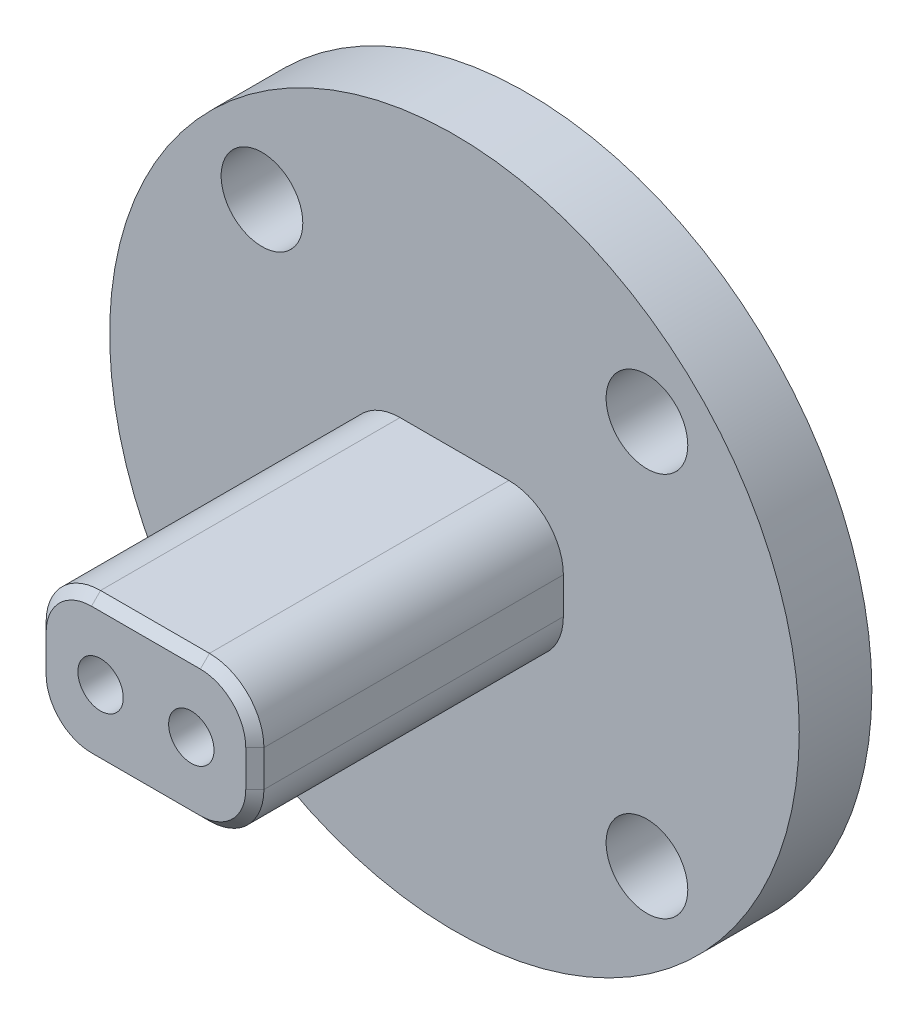
ISO-10303-21;
HEADER;
FILE_DESCRIPTION(('STEP AP214'),'2;1');
FILE_NAME('part.step','',(''),(''),'','','');
FILE_SCHEMA(('AUTOMOTIVE_DESIGN { 1 0 10303 214 1 1 1 1 }'));
ENDSEC;
DATA;
#1=APPLICATION_CONTEXT('core data for automotive mechanical design processes');
#2=APPLICATION_PROTOCOL_DEFINITION('international standard','automotive_design',2000,#1);
#3=PRODUCT_CONTEXT('',#1,'mechanical');
#4=PRODUCT('Part','Part','',(#3));
#5=PRODUCT_RELATED_PRODUCT_CATEGORY('part','',(#4));
#6=PRODUCT_DEFINITION_FORMATION('','',#4);
#7=PRODUCT_DEFINITION_CONTEXT('part definition',#1,'design');
#8=PRODUCT_DEFINITION('design','',#6,#7);
#9=PRODUCT_DEFINITION_SHAPE('','',#8);
#10=(LENGTH_UNIT() NAMED_UNIT(*) SI_UNIT(.MILLI.,.METRE.));
#11=(NAMED_UNIT(*) PLANE_ANGLE_UNIT() SI_UNIT($,.RADIAN.));
#12=(NAMED_UNIT(*) SI_UNIT($,.STERADIAN.) SOLID_ANGLE_UNIT());
#13=UNCERTAINTY_MEASURE_WITH_UNIT(LENGTH_MEASURE(1.E-05),#10,'distance_accuracy_value','');
#14=(GEOMETRIC_REPRESENTATION_CONTEXT(3) GLOBAL_UNCERTAINTY_ASSIGNED_CONTEXT((#13)) GLOBAL_UNIT_ASSIGNED_CONTEXT((#10,
#11,#12)) REPRESENTATION_CONTEXT('',''));
#15=CARTESIAN_POINT('',(0.,0.,0.));
#16=DIRECTION('',(0.,0.,1.));
#17=DIRECTION('',(1.,0.,0.));
#18=AXIS2_PLACEMENT_3D('',#15,#16,#17);
#19=CARTESIAN_POINT('',(0.,0.,4.));
#20=DIRECTION('',(0.,0.,1.));
#21=DIRECTION('',(1.,0.,0.));
#22=AXIS2_PLACEMENT_3D('',#19,#20,#21);
#23=PLANE('',#22);
#24=CARTESIAN_POINT('',(10.6066017177982,10.6066017177982,4.));
#25=DIRECTION('',(0.,0.,1.));
#26=DIRECTION('',(1.,0.,0.));
#27=AXIS2_PLACEMENT_3D('',#24,#25,#26);
#28=CIRCLE('',#27,2.24999999999999);
#29=CARTESIAN_POINT('',(12.8566017177982,10.6066017177982,4.));
#30=VERTEX_POINT('',#29);
#31=EDGE_CURVE('E221',#30,#30,#28,.T.);
#32=ORIENTED_EDGE('',*,*,#31,.F.);
#33=EDGE_LOOP('',(#32));
#34=FACE_BOUND('',#33,.T.);
#35=CARTESIAN_POINT('',(-10.6066017177982,-10.6066017177982,4.));
#36=DIRECTION('',(0.,0.,1.));
#37=DIRECTION('',(1.,0.,0.));
#38=AXIS2_PLACEMENT_3D('',#35,#36,#37);
#39=CIRCLE('',#38,2.24999999999999);
#40=CARTESIAN_POINT('',(-8.35660171779822,-10.6066017177982,4.));
#41=VERTEX_POINT('',#40);
#42=EDGE_CURVE('E229',#41,#41,#39,.T.);
#43=ORIENTED_EDGE('',*,*,#42,.F.);
#44=EDGE_LOOP('',(#43));
#45=FACE_BOUND('',#44,.T.);
#46=CARTESIAN_POINT('',(-10.6066017177982,10.6066017177982,4.));
#47=DIRECTION('',(0.,0.,1.));
#48=DIRECTION('',(1.,0.,0.));
#49=AXIS2_PLACEMENT_3D('',#46,#47,#48);
#50=CIRCLE('',#49,2.24999999999999);
#51=CARTESIAN_POINT('',(-8.35660171779823,10.6066017177982,4.));
#52=VERTEX_POINT('',#51);
#53=EDGE_CURVE('E237',#52,#52,#50,.T.);
#54=ORIENTED_EDGE('',*,*,#53,.F.);
#55=EDGE_LOOP('',(#54));
#56=FACE_BOUND('',#55,.T.);
#57=CARTESIAN_POINT('',(10.6066017177982,-10.6066017177982,4.));
#58=DIRECTION('',(0.,0.,1.));
#59=DIRECTION('',(1.,0.,0.));
#60=AXIS2_PLACEMENT_3D('',#57,#58,#59);
#61=CIRCLE('',#60,2.24999999999999);
#62=CARTESIAN_POINT('',(12.8566017177982,-10.6066017177982,4.));
#63=VERTEX_POINT('',#62);
#64=EDGE_CURVE('E245',#63,#63,#61,.T.);
#65=ORIENTED_EDGE('',*,*,#64,.F.);
#66=EDGE_LOOP('',(#65));
#67=FACE_BOUND('',#66,.T.);
#68=CARTESIAN_POINT('',(0.,0.,4.));
#69=DIRECTION('',(0.,0.,1.));
#70=DIRECTION('',(1.,0.,0.));
#71=AXIS2_PLACEMENT_3D('',#68,#69,#70);
#72=CIRCLE('',#71,19.);
#73=CARTESIAN_POINT('',(19.,0.,4.));
#74=VERTEX_POINT('',#73);
#75=EDGE_CURVE('E254',#74,#74,#72,.T.);
#76=ORIENTED_EDGE('',*,*,#75,.T.);
#77=EDGE_LOOP('',(#76));
#78=FACE_BOUND('',#77,.T.);
#79=DIRECTION('',(-1.,0.,0.));
#80=VECTOR('',#79,1.);
#81=CARTESIAN_POINT('',(-3.,4.,4.));
#82=LINE('',#81,#80);
#83=CARTESIAN_POINT('',(3.,4.,4.));
#84=VERTEX_POINT('',#83);
#85=CARTESIAN_POINT('',(-3.,4.,4.));
#86=VERTEX_POINT('',#85);
#87=EDGE_CURVE('E169',#84,#86,#82,.T.);
#88=ORIENTED_EDGE('',*,*,#87,.F.);
#89=CARTESIAN_POINT('',(3.,1.,4.));
#90=DIRECTION('',(0.,0.,1.));
#91=DIRECTION('',(-1.,0.,0.));
#92=AXIS2_PLACEMENT_3D('',#89,#90,#91);
#93=CIRCLE('',#92,3.);
#94=CARTESIAN_POINT('',(6.,1.,4.));
#95=VERTEX_POINT('',#94);
#96=EDGE_CURVE('E165',#95,#84,#93,.T.);
#97=ORIENTED_EDGE('',*,*,#96,.F.);
#98=DIRECTION('',(0.,1.,0.));
#99=VECTOR('',#98,1.);
#100=CARTESIAN_POINT('',(6.,-1.,4.));
#101=LINE('',#100,#99);
#102=CARTESIAN_POINT('',(6.,-1.,4.));
#103=VERTEX_POINT('',#102);
#104=EDGE_CURVE('E193',#103,#95,#101,.T.);
#105=ORIENTED_EDGE('',*,*,#104,.F.);
#106=CARTESIAN_POINT('',(3.,-1.,4.));
#107=DIRECTION('',(0.,0.,1.));
#108=DIRECTION('',(1.,0.,0.));
#109=AXIS2_PLACEMENT_3D('',#106,#107,#108);
#110=CIRCLE('',#109,3.);
#111=CARTESIAN_POINT('',(3.,-4.,4.));
#112=VERTEX_POINT('',#111);
#113=EDGE_CURVE('E189',#112,#103,#110,.T.);
#114=ORIENTED_EDGE('',*,*,#113,.F.);
#115=DIRECTION('',(1.,0.,0.));
#116=VECTOR('',#115,1.);
#117=CARTESIAN_POINT('',(-3.,-4.,4.));
#118=LINE('',#117,#116);
#119=CARTESIAN_POINT('',(-3.,-4.,4.));
#120=VERTEX_POINT('',#119);
#121=EDGE_CURVE('E185',#120,#112,#118,.T.);
#122=ORIENTED_EDGE('',*,*,#121,.F.);
#123=CARTESIAN_POINT('',(-3.,-1.,4.));
#124=DIRECTION('',(0.,0.,1.));
#125=DIRECTION('',(-1.,0.,0.));
#126=AXIS2_PLACEMENT_3D('',#123,#124,#125);
#127=CIRCLE('',#126,3.);
#128=CARTESIAN_POINT('',(-6.,-1.,4.));
#129=VERTEX_POINT('',#128);
#130=EDGE_CURVE('E181',#129,#120,#127,.T.);
#131=ORIENTED_EDGE('',*,*,#130,.F.);
#132=DIRECTION('',(0.,-1.,0.));
#133=VECTOR('',#132,1.);
#134=CARTESIAN_POINT('',(-6.,-1.,4.));
#135=LINE('',#134,#133);
#136=CARTESIAN_POINT('',(-6.,1.,4.));
#137=VERTEX_POINT('',#136);
#138=EDGE_CURVE('E177',#137,#129,#135,.T.);
#139=ORIENTED_EDGE('',*,*,#138,.F.);
#140=CARTESIAN_POINT('',(-3.,1.,4.));
#141=DIRECTION('',(0.,0.,1.));
#142=DIRECTION('',(-1.,0.,0.));
#143=AXIS2_PLACEMENT_3D('',#140,#141,#142);
#144=CIRCLE('',#143,3.);
#145=EDGE_CURVE('E173',#86,#137,#144,.T.);
#146=ORIENTED_EDGE('',*,*,#145,.F.);
#147=EDGE_LOOP('',(#88,#97,#105,#114,#122,#131,#139,#146));
#148=FACE_BOUND('',#147,.T.);
#149=ADVANCED_FACE('F45',(#34,#45,#56,#67,#78,#148),#23,.T.);
#150=CARTESIAN_POINT('',(0.,0.,4.));
#151=DIRECTION('',(0.,0.,-1.));
#152=DIRECTION('',(-1.,0.,0.));
#153=AXIS2_PLACEMENT_3D('',#150,#151,#152);
#154=CYLINDRICAL_SURFACE('',#153,19.);
#155=ORIENTED_EDGE('',*,*,#75,.F.);
#156=EDGE_LOOP('',(#155));
#157=FACE_BOUND('',#156,.T.);
#158=CARTESIAN_POINT('',(0.,0.,0.));
#159=DIRECTION('',(0.,0.,1.));
#160=DIRECTION('',(1.,0.,0.));
#161=AXIS2_PLACEMENT_3D('',#158,#159,#160);
#162=CIRCLE('',#161,19.);
#163=CARTESIAN_POINT('',(19.,0.,0.));
#164=VERTEX_POINT('',#163);
#165=EDGE_CURVE('E253',#164,#164,#162,.T.);
#166=ORIENTED_EDGE('',*,*,#165,.T.);
#167=EDGE_LOOP('',(#166));
#168=FACE_BOUND('',#167,.T.);
#169=ADVANCED_FACE('F409',(#157,#168),#154,.T.);
#170=CARTESIAN_POINT('',(0.,0.,0.));
#171=DIRECTION('',(0.,0.,1.));
#172=DIRECTION('',(1.,0.,0.));
#173=AXIS2_PLACEMENT_3D('',#170,#171,#172);
#174=PLANE('',#173);
#175=CARTESIAN_POINT('',(10.6066017177982,10.6066017177982,0.));
#176=DIRECTION('',(0.,0.,1.));
#177=DIRECTION('',(1.,0.,0.));
#178=AXIS2_PLACEMENT_3D('',#175,#176,#177);
#179=CIRCLE('',#178,2.25);
#180=CARTESIAN_POINT('',(12.8566017177982,10.6066017177982,0.));
#181=VERTEX_POINT('',#180);
#182=EDGE_CURVE('E225',#181,#181,#179,.T.);
#183=ORIENTED_EDGE('',*,*,#182,.T.);
#184=EDGE_LOOP('',(#183));
#185=FACE_BOUND('',#184,.T.);
#186=CARTESIAN_POINT('',(-10.6066017177982,-10.6066017177982,0.));
#187=DIRECTION('',(0.,0.,1.));
#188=DIRECTION('',(1.,0.,0.));
#189=AXIS2_PLACEMENT_3D('',#186,#187,#188);
#190=CIRCLE('',#189,2.25);
#191=CARTESIAN_POINT('',(-8.35660171779821,-10.6066017177982,0.));
#192=VERTEX_POINT('',#191);
#193=EDGE_CURVE('E233',#192,#192,#190,.T.);
#194=ORIENTED_EDGE('',*,*,#193,.T.);
#195=EDGE_LOOP('',(#194));
#196=FACE_BOUND('',#195,.T.);
#197=CARTESIAN_POINT('',(-10.6066017177982,10.6066017177982,0.));
#198=DIRECTION('',(0.,0.,1.));
#199=DIRECTION('',(1.,0.,0.));
#200=AXIS2_PLACEMENT_3D('',#197,#198,#199);
#201=CIRCLE('',#200,2.25);
#202=CARTESIAN_POINT('',(-8.35660171779822,10.6066017177982,0.));
#203=VERTEX_POINT('',#202);
#204=EDGE_CURVE('E241',#203,#203,#201,.T.);
#205=ORIENTED_EDGE('',*,*,#204,.T.);
#206=EDGE_LOOP('',(#205));
#207=FACE_BOUND('',#206,.T.);
#208=CARTESIAN_POINT('',(10.6066017177982,-10.6066017177982,0.));
#209=DIRECTION('',(0.,0.,1.));
#210=DIRECTION('',(1.,0.,0.));
#211=AXIS2_PLACEMENT_3D('',#208,#209,#210);
#212=CIRCLE('',#211,2.25);
#213=CARTESIAN_POINT('',(12.8566017177982,-10.6066017177982,0.));
#214=VERTEX_POINT('',#213);
#215=EDGE_CURVE('E249',#214,#214,#212,.T.);
#216=ORIENTED_EDGE('',*,*,#215,.T.);
#217=EDGE_LOOP('',(#216));
#218=FACE_BOUND('',#217,.T.);
#219=ORIENTED_EDGE('',*,*,#165,.F.);
#220=EDGE_LOOP('',(#219));
#221=FACE_BOUND('',#220,.T.);
#222=ADVANCED_FACE('F415',(#185,#196,#207,#218,#221),#174,.F.);
#223=CARTESIAN_POINT('',(10.6066017177982,-10.6066017177982,4.));
#224=DIRECTION('',(0.,0.,1.));
#225=DIRECTION('',(1.,0.,0.));
#226=AXIS2_PLACEMENT_3D('',#223,#224,#225);
#227=CYLINDRICAL_SURFACE('',#226,2.24999999999999);
#228=ORIENTED_EDGE('',*,*,#215,.F.);
#229=EDGE_LOOP('',(#228));
#230=FACE_BOUND('',#229,.T.);
#231=ORIENTED_EDGE('',*,*,#64,.T.);
#232=EDGE_LOOP('',(#231));
#233=FACE_BOUND('',#232,.T.);
#234=ADVANCED_FACE('F421',(#230,#233),#227,.F.);
#235=CARTESIAN_POINT('',(-10.6066017177982,10.6066017177982,4.));
#236=DIRECTION('',(0.,0.,1.));
#237=DIRECTION('',(1.,0.,0.));
#238=AXIS2_PLACEMENT_3D('',#235,#236,#237);
#239=CYLINDRICAL_SURFACE('',#238,2.24999999999999);
#240=ORIENTED_EDGE('',*,*,#204,.F.);
#241=EDGE_LOOP('',(#240));
#242=FACE_BOUND('',#241,.T.);
#243=ORIENTED_EDGE('',*,*,#53,.T.);
#244=EDGE_LOOP('',(#243));
#245=FACE_BOUND('',#244,.T.);
#246=ADVANCED_FACE('F428',(#242,#245),#239,.F.);
#247=CARTESIAN_POINT('',(-10.6066017177982,-10.6066017177982,4.));
#248=DIRECTION('',(0.,0.,1.));
#249=DIRECTION('',(1.,0.,0.));
#250=AXIS2_PLACEMENT_3D('',#247,#248,#249);
#251=CYLINDRICAL_SURFACE('',#250,2.24999999999999);
#252=ORIENTED_EDGE('',*,*,#193,.F.);
#253=EDGE_LOOP('',(#252));
#254=FACE_BOUND('',#253,.T.);
#255=ORIENTED_EDGE('',*,*,#42,.T.);
#256=EDGE_LOOP('',(#255));
#257=FACE_BOUND('',#256,.T.);
#258=ADVANCED_FACE('F448',(#254,#257),#251,.F.);
#259=CARTESIAN_POINT('',(10.6066017177982,10.6066017177982,4.));
#260=DIRECTION('',(0.,0.,1.));
#261=DIRECTION('',(1.,0.,0.));
#262=AXIS2_PLACEMENT_3D('',#259,#260,#261);
#263=CYLINDRICAL_SURFACE('',#262,2.24999999999999);
#264=ORIENTED_EDGE('',*,*,#182,.F.);
#265=EDGE_LOOP('',(#264));
#266=FACE_BOUND('',#265,.T.);
#267=ORIENTED_EDGE('',*,*,#31,.T.);
#268=EDGE_LOOP('',(#267));
#269=FACE_BOUND('',#268,.T.);
#270=ADVANCED_FACE('F454',(#266,#269),#263,.F.);
#271=CARTESIAN_POINT('',(3.,1.,21.));
#272=DIRECTION('',(0.,0.,-1.));
#273=DIRECTION('',(-1.,0.,0.));
#274=AXIS2_PLACEMENT_3D('',#271,#272,#273);
#275=CYLINDRICAL_SURFACE('',#274,3.);
#276=DIRECTION('',(0.,0.,-1.));
#277=VECTOR('',#276,1.);
#278=CARTESIAN_POINT('',(3.,4.,21.));
#279=LINE('',#278,#277);
#280=CARTESIAN_POINT('',(3.,4.,20.5));
#281=VERTEX_POINT('',#280);
#282=EDGE_CURVE('E218',#281,#84,#279,.T.);
#283=ORIENTED_EDGE('',*,*,#282,.F.);
#284=CARTESIAN_POINT('',(3.,1.,20.5));
#285=DIRECTION('',(0.,0.,-1.));
#286=DIRECTION('',(-1.,0.,0.));
#287=AXIS2_PLACEMENT_3D('',#284,#285,#286);
#288=CIRCLE('',#287,3.);
#289=CARTESIAN_POINT('',(6.,1.,20.5));
#290=VERTEX_POINT('',#289);
#291=EDGE_CURVE('E302',#281,#290,#288,.T.);
#292=ORIENTED_EDGE('',*,*,#291,.T.);
#293=DIRECTION('',(0.,0.,-1.));
#294=VECTOR('',#293,1.);
#295=CARTESIAN_POINT('',(6.,1.,21.));
#296=LINE('',#295,#294);
#297=EDGE_CURVE('E197',#290,#95,#296,.T.);
#298=ORIENTED_EDGE('',*,*,#297,.T.);
#299=ORIENTED_EDGE('',*,*,#96,.T.);
#300=EDGE_LOOP('',(#283,#292,#298,#299));
#301=FACE_BOUND('',#300,.T.);
#302=ADVANCED_FACE('F348',(#301),#275,.T.);
#303=CARTESIAN_POINT('',(-3.,4.,21.));
#304=DIRECTION('',(0.,-1.,0.));
#305=DIRECTION('',(0.,0.,-1.));
#306=AXIS2_PLACEMENT_3D('',#303,#304,#305);
#307=PLANE('',#306);
#308=DIRECTION('',(0.,0.,-1.));
#309=VECTOR('',#308,1.);
#310=CARTESIAN_POINT('',(-3.,4.,21.));
#311=LINE('',#310,#309);
#312=CARTESIAN_POINT('',(-3.,4.,20.5));
#313=VERTEX_POINT('',#312);
#314=EDGE_CURVE('E215',#313,#86,#311,.T.);
#315=ORIENTED_EDGE('',*,*,#314,.F.);
#316=DIRECTION('',(1.,0.,0.));
#317=VECTOR('',#316,1.);
#318=CARTESIAN_POINT('',(-3.,4.,20.5));
#319=LINE('',#318,#317);
#320=EDGE_CURVE('E11',#313,#281,#319,.T.);
#321=ORIENTED_EDGE('',*,*,#320,.T.);
#322=ORIENTED_EDGE('',*,*,#282,.T.);
#323=ORIENTED_EDGE('',*,*,#87,.T.);
#324=EDGE_LOOP('',(#315,#321,#322,#323));
#325=FACE_BOUND('',#324,.T.);
#326=ADVANCED_FACE('F359',(#325),#307,.F.);
#327=CARTESIAN_POINT('',(-3.,1.,21.));
#328=DIRECTION('',(0.,0.,-1.));
#329=DIRECTION('',(-1.,0.,0.));
#330=AXIS2_PLACEMENT_3D('',#327,#328,#329);
#331=CYLINDRICAL_SURFACE('',#330,3.);
#332=DIRECTION('',(0.,0.,-1.));
#333=VECTOR('',#332,1.);
#334=CARTESIAN_POINT('',(-6.,1.,21.));
#335=LINE('',#334,#333);
#336=CARTESIAN_POINT('',(-6.,1.,20.5));
#337=VERTEX_POINT('',#336);
#338=EDGE_CURVE('E212',#337,#137,#335,.T.);
#339=ORIENTED_EDGE('',*,*,#338,.F.);
#340=CARTESIAN_POINT('',(-3.,1.,20.5));
#341=DIRECTION('',(0.,0.,-1.));
#342=DIRECTION('',(-1.,0.,0.));
#343=AXIS2_PLACEMENT_3D('',#340,#341,#342);
#344=CIRCLE('',#343,3.);
#345=EDGE_CURVE('E55',#337,#313,#344,.T.);
#346=ORIENTED_EDGE('',*,*,#345,.T.);
#347=ORIENTED_EDGE('',*,*,#314,.T.);
#348=ORIENTED_EDGE('',*,*,#145,.T.);
#349=EDGE_LOOP('',(#339,#346,#347,#348));
#350=FACE_BOUND('',#349,.T.);
#351=ADVANCED_FACE('F360',(#350),#331,.T.);
#352=CARTESIAN_POINT('',(-6.,-1.,21.));
#353=DIRECTION('',(1.,0.,0.));
#354=DIRECTION('',(0.,0.,-1.));
#355=AXIS2_PLACEMENT_3D('',#352,#353,#354);
#356=PLANE('',#355);
#357=DIRECTION('',(0.,0.,-1.));
#358=VECTOR('',#357,1.);
#359=CARTESIAN_POINT('',(-6.,-1.,21.));
#360=LINE('',#359,#358);
#361=CARTESIAN_POINT('',(-6.,-1.,20.5));
#362=VERTEX_POINT('',#361);
#363=EDGE_CURVE('E209',#362,#129,#360,.T.);
#364=ORIENTED_EDGE('',*,*,#363,.F.);
#365=DIRECTION('',(0.,1.,0.));
#366=VECTOR('',#365,1.);
#367=CARTESIAN_POINT('',(-6.,-1.,20.5));
#368=LINE('',#367,#366);
#369=EDGE_CURVE('E299',#362,#337,#368,.T.);
#370=ORIENTED_EDGE('',*,*,#369,.T.);
#371=ORIENTED_EDGE('',*,*,#338,.T.);
#372=ORIENTED_EDGE('',*,*,#138,.T.);
#373=EDGE_LOOP('',(#364,#370,#371,#372));
#374=FACE_BOUND('',#373,.T.);
#375=ADVANCED_FACE('F365',(#374),#356,.F.);
#376=CARTESIAN_POINT('',(-3.,-1.,21.));
#377=DIRECTION('',(0.,0.,-1.));
#378=DIRECTION('',(-1.,0.,0.));
#379=AXIS2_PLACEMENT_3D('',#376,#377,#378);
#380=CYLINDRICAL_SURFACE('',#379,3.);
#381=DIRECTION('',(0.,0.,-1.));
#382=VECTOR('',#381,1.);
#383=CARTESIAN_POINT('',(-3.,-4.,21.));
#384=LINE('',#383,#382);
#385=CARTESIAN_POINT('',(-3.,-4.,20.5));
#386=VERTEX_POINT('',#385);
#387=EDGE_CURVE('E206',#386,#120,#384,.T.);
#388=ORIENTED_EDGE('',*,*,#387,.F.);
#389=CARTESIAN_POINT('',(-3.,-1.,20.5));
#390=DIRECTION('',(0.,0.,-1.));
#391=DIRECTION('',(-1.,0.,0.));
#392=AXIS2_PLACEMENT_3D('',#389,#390,#391);
#393=CIRCLE('',#392,3.);
#394=EDGE_CURVE('E293',#386,#362,#393,.T.);
#395=ORIENTED_EDGE('',*,*,#394,.T.);
#396=ORIENTED_EDGE('',*,*,#363,.T.);
#397=ORIENTED_EDGE('',*,*,#130,.T.);
#398=EDGE_LOOP('',(#388,#395,#396,#397));
#399=FACE_BOUND('',#398,.T.);
#400=ADVANCED_FACE('F469',(#399),#380,.T.);
#401=CARTESIAN_POINT('',(-3.,-4.,21.));
#402=DIRECTION('',(0.,1.,0.));
#403=DIRECTION('',(0.,0.,1.));
#404=AXIS2_PLACEMENT_3D('',#401,#402,#403);
#405=PLANE('',#404);
#406=DIRECTION('',(0.,0.,-1.));
#407=VECTOR('',#406,1.);
#408=CARTESIAN_POINT('',(3.,-4.,21.));
#409=LINE('',#408,#407);
#410=CARTESIAN_POINT('',(3.,-4.,20.5));
#411=VERTEX_POINT('',#410);
#412=EDGE_CURVE('E203',#411,#112,#409,.T.);
#413=ORIENTED_EDGE('',*,*,#412,.F.);
#414=DIRECTION('',(-1.,0.,0.));
#415=VECTOR('',#414,1.);
#416=CARTESIAN_POINT('',(-3.,-4.,20.5));
#417=LINE('',#416,#415);
#418=EDGE_CURVE('E286',#411,#386,#417,.T.);
#419=ORIENTED_EDGE('',*,*,#418,.T.);
#420=ORIENTED_EDGE('',*,*,#387,.T.);
#421=ORIENTED_EDGE('',*,*,#121,.T.);
#422=EDGE_LOOP('',(#413,#419,#420,#421));
#423=FACE_BOUND('',#422,.T.);
#424=ADVANCED_FACE('F393',(#423),#405,.F.);
#425=CARTESIAN_POINT('',(3.,-1.,21.));
#426=DIRECTION('',(0.,0.,-1.));
#427=DIRECTION('',(-1.,0.,0.));
#428=AXIS2_PLACEMENT_3D('',#425,#426,#427);
#429=CYLINDRICAL_SURFACE('',#428,3.);
#430=DIRECTION('',(0.,0.,-1.));
#431=VECTOR('',#430,1.);
#432=CARTESIAN_POINT('',(6.,-1.,21.));
#433=LINE('',#432,#431);
#434=CARTESIAN_POINT('',(6.,-1.,20.5));
#435=VERTEX_POINT('',#434);
#436=EDGE_CURVE('E200',#435,#103,#433,.T.);
#437=ORIENTED_EDGE('',*,*,#436,.F.);
#438=CARTESIAN_POINT('',(3.,-1.,20.5));
#439=DIRECTION('',(0.,0.,-1.));
#440=DIRECTION('',(-1.,0.,0.));
#441=AXIS2_PLACEMENT_3D('',#438,#439,#440);
#442=CIRCLE('',#441,3.);
#443=EDGE_CURVE('E290',#435,#411,#442,.T.);
#444=ORIENTED_EDGE('',*,*,#443,.T.);
#445=ORIENTED_EDGE('',*,*,#412,.T.);
#446=ORIENTED_EDGE('',*,*,#113,.T.);
#447=EDGE_LOOP('',(#437,#444,#445,#446));
#448=FACE_BOUND('',#447,.T.);
#449=ADVANCED_FACE('F390',(#448),#429,.T.);
#450=CARTESIAN_POINT('',(6.,-1.,21.));
#451=DIRECTION('',(-1.,0.,0.));
#452=DIRECTION('',(0.,0.,1.));
#453=AXIS2_PLACEMENT_3D('',#450,#451,#452);
#454=PLANE('',#453);
#455=ORIENTED_EDGE('',*,*,#297,.F.);
#456=DIRECTION('',(0.,-1.,0.));
#457=VECTOR('',#456,1.);
#458=CARTESIAN_POINT('',(6.,-1.,20.5));
#459=LINE('',#458,#457);
#460=EDGE_CURVE('E296',#290,#435,#459,.T.);
#461=ORIENTED_EDGE('',*,*,#460,.T.);
#462=ORIENTED_EDGE('',*,*,#436,.T.);
#463=ORIENTED_EDGE('',*,*,#104,.T.);
#464=EDGE_LOOP('',(#455,#461,#462,#463));
#465=FACE_BOUND('',#464,.T.);
#466=ADVANCED_FACE('F350',(#465),#454,.F.);
#467=CARTESIAN_POINT('',(3.,1.,21.));
#468=DIRECTION('',(0.,0.,-1.));
#469=DIRECTION('',(-1.,0.,0.));
#470=AXIS2_PLACEMENT_3D('',#467,#468,#469);
#471=PLANE('',#470);
#472=CARTESIAN_POINT('',(-2.5,0.,21.));
#473=DIRECTION('',(0.,0.,1.));
#474=DIRECTION('',(1.,0.,0.));
#475=AXIS2_PLACEMENT_3D('',#472,#473,#474);
#476=CIRCLE('',#475,1.25);
#477=CARTESIAN_POINT('',(-1.25,0.,21.));
#478=VERTEX_POINT('',#477);
#479=EDGE_CURVE('E151',#478,#478,#476,.T.);
#480=ORIENTED_EDGE('',*,*,#479,.F.);
#481=EDGE_LOOP('',(#480));
#482=FACE_BOUND('',#481,.T.);
#483=CARTESIAN_POINT('',(2.5,0.,21.));
#484=DIRECTION('',(0.,0.,1.));
#485=DIRECTION('',(1.,0.,0.));
#486=AXIS2_PLACEMENT_3D('',#483,#484,#485);
#487=CIRCLE('',#486,1.25);
#488=CARTESIAN_POINT('',(3.75,0.,21.));
#489=VERTEX_POINT('',#488);
#490=EDGE_CURVE('E150',#489,#489,#487,.T.);
#491=ORIENTED_EDGE('',*,*,#490,.F.);
#492=EDGE_LOOP('',(#491));
#493=FACE_BOUND('',#492,.T.);
#494=CARTESIAN_POINT('',(-3.,-1.,21.));
#495=DIRECTION('',(0.,0.,-1.));
#496=DIRECTION('',(-1.,0.,0.));
#497=AXIS2_PLACEMENT_3D('',#494,#495,#496);
#498=CIRCLE('',#497,2.50000000000001);
#499=CARTESIAN_POINT('',(-5.50000000000001,-1.,21.));
#500=VERTEX_POINT('',#499);
#501=CARTESIAN_POINT('',(-3.,-3.50000000000001,21.));
#502=VERTEX_POINT('',#501);
#503=EDGE_CURVE('E276',#500,#502,#498,.F.);
#504=ORIENTED_EDGE('',*,*,#503,.T.);
#505=DIRECTION('',(1.,0.,0.));
#506=VECTOR('',#505,1.);
#507=CARTESIAN_POINT('',(3.,-3.50000000000001,21.));
#508=LINE('',#507,#506);
#509=CARTESIAN_POINT('',(3.,-3.50000000000001,21.));
#510=VERTEX_POINT('',#509);
#511=EDGE_CURVE('E282',#502,#510,#508,.T.);
#512=ORIENTED_EDGE('',*,*,#511,.T.);
#513=CARTESIAN_POINT('',(3.,-1.,21.));
#514=DIRECTION('',(0.,0.,-1.));
#515=DIRECTION('',(-1.,0.,0.));
#516=AXIS2_PLACEMENT_3D('',#513,#514,#515);
#517=CIRCLE('',#516,2.50000000000001);
#518=CARTESIAN_POINT('',(5.5,-1.,21.));
#519=VERTEX_POINT('',#518);
#520=EDGE_CURVE('E279',#510,#519,#517,.F.);
#521=ORIENTED_EDGE('',*,*,#520,.T.);
#522=DIRECTION('',(0.,1.,0.));
#523=VECTOR('',#522,1.);
#524=CARTESIAN_POINT('',(5.5,1.,21.));
#525=LINE('',#524,#523);
#526=CARTESIAN_POINT('',(5.5,1.,21.));
#527=VERTEX_POINT('',#526);
#528=EDGE_CURVE('E273',#519,#527,#525,.T.);
#529=ORIENTED_EDGE('',*,*,#528,.T.);
#530=CARTESIAN_POINT('',(3.,1.,21.));
#531=DIRECTION('',(0.,0.,-1.));
#532=DIRECTION('',(-1.,0.,0.));
#533=AXIS2_PLACEMENT_3D('',#530,#531,#532);
#534=CIRCLE('',#533,2.50000000000001);
#535=CARTESIAN_POINT('',(3.,3.50000000000001,21.));
#536=VERTEX_POINT('',#535);
#537=EDGE_CURVE('E267',#527,#536,#534,.F.);
#538=ORIENTED_EDGE('',*,*,#537,.T.);
#539=DIRECTION('',(-1.,0.,0.));
#540=VECTOR('',#539,1.);
#541=CARTESIAN_POINT('',(3.,3.50000000000001,21.));
#542=LINE('',#541,#540);
#543=CARTESIAN_POINT('',(-3.,3.50000000000001,21.));
#544=VERTEX_POINT('',#543);
#545=EDGE_CURVE('E258',#536,#544,#542,.T.);
#546=ORIENTED_EDGE('',*,*,#545,.T.);
#547=CARTESIAN_POINT('',(-3.,1.,21.));
#548=DIRECTION('',(0.,0.,-1.));
#549=DIRECTION('',(-1.,0.,0.));
#550=AXIS2_PLACEMENT_3D('',#547,#548,#549);
#551=CIRCLE('',#550,2.50000000000001);
#552=CARTESIAN_POINT('',(-5.50000000000001,1.,21.));
#553=VERTEX_POINT('',#552);
#554=EDGE_CURVE('E264',#544,#553,#551,.F.);
#555=ORIENTED_EDGE('',*,*,#554,.T.);
#556=DIRECTION('',(0.,-1.,0.));
#557=VECTOR('',#556,1.);
#558=CARTESIAN_POINT('',(-5.50000000000001,1.,21.));
#559=LINE('',#558,#557);
#560=EDGE_CURVE('E270',#553,#500,#559,.T.);
#561=ORIENTED_EDGE('',*,*,#560,.T.);
#562=EDGE_LOOP('',(#504,#512,#521,#529,#538,#546,#555,#561));
#563=FACE_BOUND('',#562,.T.);
#564=ADVANCED_FACE('F378',(#482,#493,#563),#471,.F.);
#565=CARTESIAN_POINT('',(3.,3.50000000000001,21.));
#566=DIRECTION('',(0.,-0.707106781186552,-0.707106781186543));
#567=DIRECTION('',(-1.,0.,0.));
#568=AXIS2_PLACEMENT_3D('',#565,#566,#567);
#569=PLANE('',#568);
#570=DIRECTION('',(0.,-0.707106781186543,0.707106781186552));
#571=VECTOR('',#570,1.);
#572=CARTESIAN_POINT('',(3.,4.,20.5));
#573=LINE('',#572,#571);
#574=EDGE_CURVE('E327',#281,#536,#573,.T.);
#575=ORIENTED_EDGE('',*,*,#574,.F.);
#576=ORIENTED_EDGE('',*,*,#320,.F.);
#577=DIRECTION('',(0.,0.707106781186543,-0.707106781186552));
#578=VECTOR('',#577,1.);
#579=CARTESIAN_POINT('',(-3.,3.50000000000001,21.));
#580=LINE('',#579,#578);
#581=EDGE_CURVE('E49',#544,#313,#580,.T.);
#582=ORIENTED_EDGE('',*,*,#581,.F.);
#583=ORIENTED_EDGE('',*,*,#545,.F.);
#584=EDGE_LOOP('',(#575,#576,#582,#583));
#585=FACE_BOUND('',#584,.T.);
#586=ADVANCED_FACE('F47',(#585),#569,.F.);
#587=CARTESIAN_POINT('',(-3.,1.,21.));
#588=DIRECTION('',(0.,0.,-1.));
#589=DIRECTION('',(-1.,0.,0.));
#590=AXIS2_PLACEMENT_3D('',#587,#588,#589);
#591=CONICAL_SURFACE('',#590,2.50000000000001,0.785398163397441);
#592=ORIENTED_EDGE('',*,*,#581,.T.);
#593=ORIENTED_EDGE('',*,*,#345,.F.);
#594=DIRECTION('',(-0.707106781186543,0.,-0.707106781186552));
#595=VECTOR('',#594,1.);
#596=CARTESIAN_POINT('',(-5.50000000000001,1.,21.));
#597=LINE('',#596,#595);
#598=EDGE_CURVE('E324',#553,#337,#597,.T.);
#599=ORIENTED_EDGE('',*,*,#598,.F.);
#600=ORIENTED_EDGE('',*,*,#554,.F.);
#601=EDGE_LOOP('',(#592,#593,#599,#600));
#602=FACE_BOUND('',#601,.T.);
#603=ADVANCED_FACE('F339',(#602),#591,.T.);
#604=CARTESIAN_POINT('',(3.,1.,21.));
#605=DIRECTION('',(0.,0.,-1.));
#606=DIRECTION('',(-1.,0.,0.));
#607=AXIS2_PLACEMENT_3D('',#604,#605,#606);
#608=CONICAL_SURFACE('',#607,2.50000000000001,0.785398163397441);
#609=ORIENTED_EDGE('',*,*,#574,.T.);
#610=ORIENTED_EDGE('',*,*,#537,.F.);
#611=DIRECTION('',(-0.707106781186543,0.,0.707106781186552));
#612=VECTOR('',#611,1.);
#613=CARTESIAN_POINT('',(6.,1.,20.5));
#614=LINE('',#613,#612);
#615=EDGE_CURVE('E320',#290,#527,#614,.T.);
#616=ORIENTED_EDGE('',*,*,#615,.F.);
#617=ORIENTED_EDGE('',*,*,#291,.F.);
#618=EDGE_LOOP('',(#609,#610,#616,#617));
#619=FACE_BOUND('',#618,.T.);
#620=ADVANCED_FACE('F344',(#619),#608,.T.);
#621=CARTESIAN_POINT('',(-5.50000000000001,1.,21.));
#622=DIRECTION('',(0.707106781186553,0.,-0.707106781186542));
#623=DIRECTION('',(0.,-1.,0.));
#624=AXIS2_PLACEMENT_3D('',#621,#622,#623);
#625=PLANE('',#624);
#626=ORIENTED_EDGE('',*,*,#598,.T.);
#627=ORIENTED_EDGE('',*,*,#369,.F.);
#628=DIRECTION('',(-0.707106781186542,0.,-0.707106781186553));
#629=VECTOR('',#628,1.);
#630=CARTESIAN_POINT('',(-5.50000000000001,-1.,21.));
#631=LINE('',#630,#629);
#632=EDGE_CURVE('E316',#500,#362,#631,.T.);
#633=ORIENTED_EDGE('',*,*,#632,.F.);
#634=ORIENTED_EDGE('',*,*,#560,.F.);
#635=EDGE_LOOP('',(#626,#627,#633,#634));
#636=FACE_BOUND('',#635,.T.);
#637=ADVANCED_FACE('F369',(#636),#625,.F.);
#638=CARTESIAN_POINT('',(5.5,1.,21.));
#639=DIRECTION('',(-0.707106781186552,0.,-0.707106781186543));
#640=DIRECTION('',(0.,1.,0.));
#641=AXIS2_PLACEMENT_3D('',#638,#639,#640);
#642=PLANE('',#641);
#643=ORIENTED_EDGE('',*,*,#615,.T.);
#644=ORIENTED_EDGE('',*,*,#528,.F.);
#645=DIRECTION('',(-0.707106781186543,0.,0.707106781186552));
#646=VECTOR('',#645,1.);
#647=CARTESIAN_POINT('',(6.,-1.,20.5));
#648=LINE('',#647,#646);
#649=EDGE_CURVE('E312',#435,#519,#648,.T.);
#650=ORIENTED_EDGE('',*,*,#649,.F.);
#651=ORIENTED_EDGE('',*,*,#460,.F.);
#652=EDGE_LOOP('',(#643,#644,#650,#651));
#653=FACE_BOUND('',#652,.T.);
#654=ADVANCED_FACE('F381',(#653),#642,.F.);
#655=CARTESIAN_POINT('',(-3.,-1.,21.));
#656=DIRECTION('',(0.,0.,-1.));
#657=DIRECTION('',(-1.,0.,0.));
#658=AXIS2_PLACEMENT_3D('',#655,#656,#657);
#659=CONICAL_SURFACE('',#658,2.50000000000001,0.785398163397441);
#660=ORIENTED_EDGE('',*,*,#632,.T.);
#661=ORIENTED_EDGE('',*,*,#394,.F.);
#662=DIRECTION('',(0.,-0.707106781186543,-0.707106781186552));
#663=VECTOR('',#662,1.);
#664=CARTESIAN_POINT('',(-3.,-3.50000000000001,21.));
#665=LINE('',#664,#663);
#666=EDGE_CURVE('E309',#502,#386,#665,.T.);
#667=ORIENTED_EDGE('',*,*,#666,.F.);
#668=ORIENTED_EDGE('',*,*,#503,.F.);
#669=EDGE_LOOP('',(#660,#661,#667,#668));
#670=FACE_BOUND('',#669,.T.);
#671=ADVANCED_FACE('F374',(#670),#659,.T.);
#672=CARTESIAN_POINT('',(3.,-1.,21.));
#673=DIRECTION('',(0.,0.,-1.));
#674=DIRECTION('',(-1.,0.,0.));
#675=AXIS2_PLACEMENT_3D('',#672,#673,#674);
#676=CONICAL_SURFACE('',#675,2.50000000000001,0.785398163397441);
#677=ORIENTED_EDGE('',*,*,#649,.T.);
#678=ORIENTED_EDGE('',*,*,#520,.F.);
#679=DIRECTION('',(0.,0.707106781186543,0.707106781186552));
#680=VECTOR('',#679,1.);
#681=CARTESIAN_POINT('',(3.,-4.,20.5));
#682=LINE('',#681,#680);
#683=EDGE_CURVE('E164',#411,#510,#682,.T.);
#684=ORIENTED_EDGE('',*,*,#683,.F.);
#685=ORIENTED_EDGE('',*,*,#443,.F.);
#686=EDGE_LOOP('',(#677,#678,#684,#685));
#687=FACE_BOUND('',#686,.T.);
#688=ADVANCED_FACE('F387',(#687),#676,.T.);
#689=CARTESIAN_POINT('',(3.,-3.50000000000001,21.));
#690=DIRECTION('',(0.,0.707106781186552,-0.707106781186543));
#691=DIRECTION('',(1.,0.,0.));
#692=AXIS2_PLACEMENT_3D('',#689,#690,#691);
#693=PLANE('',#692);
#694=ORIENTED_EDGE('',*,*,#666,.T.);
#695=ORIENTED_EDGE('',*,*,#418,.F.);
#696=ORIENTED_EDGE('',*,*,#683,.T.);
#697=ORIENTED_EDGE('',*,*,#511,.F.);
#698=EDGE_LOOP('',(#694,#695,#696,#697));
#699=FACE_BOUND('',#698,.T.);
#700=ADVANCED_FACE('F396',(#699),#693,.F.);
#701=CARTESIAN_POINT('',(2.5,0.,13.5));
#702=DIRECTION('',(0.,0.,1.));
#703=DIRECTION('',(1.,0.,0.));
#704=AXIS2_PLACEMENT_3D('',#701,#702,#703);
#705=CONICAL_SURFACE('',#704,1.25,1.02974425867665);
#706=CARTESIAN_POINT('',(2.5,0.,12.7489242262155));
#707=VERTEX_POINT('',#706);
#708=VERTEX_LOOP('',#707);
#709=FACE_BOUND('',#708,.T.);
#710=CARTESIAN_POINT('',(2.5,0.,13.5));
#711=DIRECTION('',(0.,0.,1.));
#712=DIRECTION('',(1.,0.,0.));
#713=AXIS2_PLACEMENT_3D('',#710,#711,#712);
#714=CIRCLE('',#713,1.25);
#715=CARTESIAN_POINT('',(3.75,0.,13.5));
#716=VERTEX_POINT('',#715);
#717=EDGE_CURVE('E156',#716,#716,#714,.T.);
#718=ORIENTED_EDGE('',*,*,#717,.T.);
#719=EDGE_LOOP('',(#718));
#720=FACE_BOUND('',#719,.T.);
#721=ADVANCED_FACE('F398',(#709,#720),#705,.F.);
#722=CARTESIAN_POINT('',(2.5,0.,21.));
#723=DIRECTION('',(0.,0.,1.));
#724=DIRECTION('',(1.,0.,0.));
#725=AXIS2_PLACEMENT_3D('',#722,#723,#724);
#726=CYLINDRICAL_SURFACE('',#725,1.25);
#727=ORIENTED_EDGE('',*,*,#717,.F.);
#728=EDGE_LOOP('',(#727));
#729=FACE_BOUND('',#728,.T.);
#730=ORIENTED_EDGE('',*,*,#490,.T.);
#731=EDGE_LOOP('',(#730));
#732=FACE_BOUND('',#731,.T.);
#733=ADVANCED_FACE('F143',(#729,#732),#726,.F.);
#734=CARTESIAN_POINT('',(-2.5,0.,13.5));
#735=DIRECTION('',(0.,0.,1.));
#736=DIRECTION('',(1.,0.,0.));
#737=AXIS2_PLACEMENT_3D('',#734,#735,#736);
#738=CONICAL_SURFACE('',#737,1.25,1.02974425867665);
#739=CARTESIAN_POINT('',(-2.5,0.,12.7489242262155));
#740=VERTEX_POINT('',#739);
#741=VERTEX_LOOP('',#740);
#742=FACE_BOUND('',#741,.T.);
#743=CARTESIAN_POINT('',(-2.5,0.,13.5));
#744=DIRECTION('',(0.,0.,1.));
#745=DIRECTION('',(1.,0.,0.));
#746=AXIS2_PLACEMENT_3D('',#743,#744,#745);
#747=CIRCLE('',#746,1.25);
#748=CARTESIAN_POINT('',(-1.25,0.,13.5));
#749=VERTEX_POINT('',#748);
#750=EDGE_CURVE('E147',#749,#749,#747,.T.);
#751=ORIENTED_EDGE('',*,*,#750,.T.);
#752=EDGE_LOOP('',(#751));
#753=FACE_BOUND('',#752,.T.);
#754=ADVANCED_FACE('F139',(#742,#753),#738,.F.);
#755=CARTESIAN_POINT('',(-2.5,0.,21.));
#756=DIRECTION('',(0.,0.,1.));
#757=DIRECTION('',(1.,0.,0.));
#758=AXIS2_PLACEMENT_3D('',#755,#756,#757);
#759=CYLINDRICAL_SURFACE('',#758,1.25);
#760=ORIENTED_EDGE('',*,*,#750,.F.);
#761=EDGE_LOOP('',(#760));
#762=FACE_BOUND('',#761,.T.);
#763=ORIENTED_EDGE('',*,*,#479,.T.);
#764=EDGE_LOOP('',(#763));
#765=FACE_BOUND('',#764,.T.);
#766=ADVANCED_FACE('F142',(#762,#765),#759,.F.);
#767=CLOSED_SHELL('',(#149,#169,#222,#234,#246,#258,#270,#302,#326,#351,#375,#400,#424,#449,
#466,#564,#586,#603,#620,#637,#654,#671,#688,#700,#721,#733,#754,#766));
#768=MANIFOLD_SOLID_BREP('B2',#767);
#769=ADVANCED_BREP_SHAPE_REPRESENTATION('',(#18,#768),#14);
#770=SHAPE_DEFINITION_REPRESENTATION(#9,#769);
ENDSEC;
END-ISO-10303-21;
